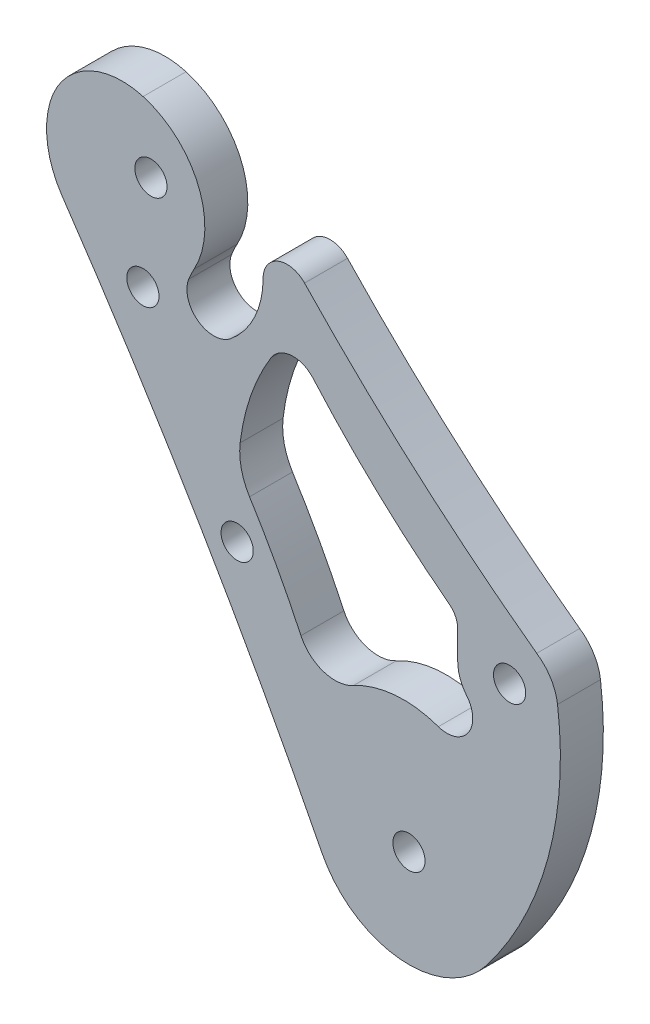
ISO-10303-21;
HEADER;
FILE_DESCRIPTION(('STEP AP214'),'2;1');
FILE_NAME('part.step','',(''),(''),'','','');
FILE_SCHEMA(('AUTOMOTIVE_DESIGN { 1 0 10303 214 1 1 1 1 }'));
ENDSEC;
DATA;
#1=APPLICATION_CONTEXT('core data for automotive mechanical design processes');
#2=APPLICATION_PROTOCOL_DEFINITION('international standard','automotive_design',2000,#1);
#3=PRODUCT_CONTEXT('',#1,'mechanical');
#4=PRODUCT('Part','Part','',(#3));
#5=PRODUCT_RELATED_PRODUCT_CATEGORY('part','',(#4));
#6=PRODUCT_DEFINITION_FORMATION('','',#4);
#7=PRODUCT_DEFINITION_CONTEXT('part definition',#1,'design');
#8=PRODUCT_DEFINITION('design','',#6,#7);
#9=PRODUCT_DEFINITION_SHAPE('','',#8);
#10=(LENGTH_UNIT() NAMED_UNIT(*) SI_UNIT(.MILLI.,.METRE.));
#11=(NAMED_UNIT(*) PLANE_ANGLE_UNIT() SI_UNIT($,.RADIAN.));
#12=(NAMED_UNIT(*) SI_UNIT($,.STERADIAN.) SOLID_ANGLE_UNIT());
#13=UNCERTAINTY_MEASURE_WITH_UNIT(LENGTH_MEASURE(1.E-05),#10,'distance_accuracy_value','');
#14=(GEOMETRIC_REPRESENTATION_CONTEXT(3) GLOBAL_UNCERTAINTY_ASSIGNED_CONTEXT((#13)) GLOBAL_UNIT_ASSIGNED_CONTEXT((#10,
#11,#12)) REPRESENTATION_CONTEXT('',''));
#15=CARTESIAN_POINT('',(0.,0.,0.));
#16=DIRECTION('',(0.,0.,1.));
#17=DIRECTION('',(1.,0.,0.));
#18=AXIS2_PLACEMENT_3D('',#15,#16,#17);
#19=CARTESIAN_POINT('',(66.2668362517356,54.831618734875,4.));
#20=DIRECTION('',(0.,0.,-1.));
#21=DIRECTION('',(-1.,0.,0.));
#22=AXIS2_PLACEMENT_3D('',#19,#20,#21);
#23=PLANE('',#22);
#24=CARTESIAN_POINT('',(76.3123714532048,30.2000942948942,4.));
#25=DIRECTION('',(0.,0.,1.));
#26=DIRECTION('',(1.,0.,0.));
#27=AXIS2_PLACEMENT_3D('',#24,#25,#26);
#28=CIRCLE('',#27,1.5);
#29=CARTESIAN_POINT('',(77.8123714532048,30.2000942948942,4.));
#30=VERTEX_POINT('',#29);
#31=EDGE_CURVE('E253',#30,#30,#28,.T.);
#32=ORIENTED_EDGE('',*,*,#31,.F.);
#33=EDGE_LOOP('',(#32));
#34=FACE_BOUND('',#33,.T.);
#35=CARTESIAN_POINT('',(67.5354671080567,46.360427952564,4.));
#36=DIRECTION('',(0.,0.,1.));
#37=DIRECTION('',(1.,0.,0.));
#38=AXIS2_PLACEMENT_3D('',#35,#36,#37);
#39=CIRCLE('',#38,1.50110642000384);
#40=CARTESIAN_POINT('',(69.0365735280606,46.360427952564,4.));
#41=VERTEX_POINT('',#40);
#42=EDGE_CURVE('E318',#41,#41,#39,.T.);
#43=ORIENTED_EDGE('',*,*,#42,.F.);
#44=EDGE_LOOP('',(#43));
#45=FACE_BOUND('',#44,.T.);
#46=CARTESIAN_POINT('',(92.3123714532048,13.2000942948942,4.));
#47=DIRECTION('',(0.,0.,1.));
#48=DIRECTION('',(1.,0.,0.));
#49=AXIS2_PLACEMENT_3D('',#46,#47,#48);
#50=CIRCLE('',#49,1.5);
#51=CARTESIAN_POINT('',(93.8123714532048,13.2000942948942,4.));
#52=VERTEX_POINT('',#51);
#53=EDGE_CURVE('E326',#52,#52,#50,.T.);
#54=ORIENTED_EDGE('',*,*,#53,.F.);
#55=EDGE_LOOP('',(#54));
#56=FACE_BOUND('',#55,.T.);
#57=CARTESIAN_POINT('',(101.682075095834,31.4335430539551,4.));
#58=DIRECTION('',(0.,0.,1.));
#59=DIRECTION('',(1.,0.,0.));
#60=AXIS2_PLACEMENT_3D('',#57,#58,#59);
#61=CIRCLE('',#60,1.5);
#62=CARTESIAN_POINT('',(103.182075095834,31.4335430539551,4.));
#63=VERTEX_POINT('',#62);
#64=EDGE_CURVE('E334',#63,#63,#61,.T.);
#65=ORIENTED_EDGE('',*,*,#64,.F.);
#66=EDGE_LOOP('',(#65));
#67=FACE_BOUND('',#66,.T.);
#68=CARTESIAN_POINT('',(68.2854671080567,55.560427952564,4.));
#69=DIRECTION('',(0.,0.,1.));
#70=DIRECTION('',(1.,0.,0.));
#71=AXIS2_PLACEMENT_3D('',#68,#69,#70);
#72=CIRCLE('',#71,1.5);
#73=CARTESIAN_POINT('',(69.7854671080567,55.560427952564,4.));
#74=VERTEX_POINT('',#73);
#75=EDGE_CURVE('E342',#74,#74,#72,.T.);
#76=ORIENTED_EDGE('',*,*,#75,.F.);
#77=EDGE_LOOP('',(#76));
#78=FACE_BOUND('',#77,.T.);
#79=CARTESIAN_POINT('',(66.9297595318174,54.6414005412217,4.));
#80=DIRECTION('',(0.,0.,1.));
#81=DIRECTION('',(-1.,0.,0.));
#82=AXIS2_PLACEMENT_3D('',#79,#80,#81);
#83=CIRCLE('',#82,8.36216252942286);
#84=CARTESIAN_POINT('',(58.8919443420733,56.9477589574276,4.));
#85=VERTEX_POINT('',#84);
#86=CARTESIAN_POINT('',(60.0269446482824,49.9215585044443,4.));
#87=VERTEX_POINT('',#86);
#88=EDGE_CURVE('E350',#85,#87,#83,.T.);
#89=ORIENTED_EDGE('',*,*,#88,.T.);
#90=CARTESIAN_POINT('',(-239.950657402607,-155.189967755456,4.));
#91=DIRECTION('',(0.,0.,-1.));
#92=DIRECTION('',(-1.,0.,0.));
#93=AXIS2_PLACEMENT_3D('',#90,#91,#92);
#94=CIRCLE('',#93,363.396890378643);
#95=CARTESIAN_POINT('',(84.1952739936411,9.086369847153,4.));
#96=VERTEX_POINT('',#95);
#97=EDGE_CURVE('E354',#87,#96,#94,.T.);
#98=ORIENTED_EDGE('',*,*,#97,.T.);
#99=CARTESIAN_POINT('',(92.3123714532048,13.2000942948942,4.));
#100=DIRECTION('',(0.,0.,1.));
#101=DIRECTION('',(1.,0.,0.));
#102=AXIS2_PLACEMENT_3D('',#99,#100,#101);
#103=CIRCLE('',#102,9.09999999999997);
#104=CARTESIAN_POINT('',(99.5090678289681,7.63075310629086,4.));
#105=VERTEX_POINT('',#104);
#106=EDGE_CURVE('E358',#96,#105,#103,.T.);
#107=ORIENTED_EDGE('',*,*,#106,.T.);
#108=CARTESIAN_POINT('',(73.4111578948811,27.8272651089185,4.));
#109=DIRECTION('',(0.,0.,1.));
#110=DIRECTION('',(1.,0.,0.));
#111=AXIS2_PLACEMENT_3D('',#108,#109,#110);
#112=CIRCLE('',#111,33.);
#113=CARTESIAN_POINT('',(106.145904127564,32.0029553610661,4.));
#114=VERTEX_POINT('',#113);
#115=EDGE_CURVE('E361',#105,#114,#112,.T.);
#116=ORIENTED_EDGE('',*,*,#115,.T.);
#117=CARTESIAN_POINT('',(101.682075095834,31.4335430539551,4.));
#118=DIRECTION('',(0.,0.,1.));
#119=DIRECTION('',(1.,0.,0.));
#120=AXIS2_PLACEMENT_3D('',#117,#118,#119);
#121=CIRCLE('',#120,4.49999999999999);
#122=CARTESIAN_POINT('',(104.210334732775,35.1561635299391,4.));
#123=VERTEX_POINT('',#122);
#124=EDGE_CURVE('E364',#114,#123,#121,.T.);
#125=ORIENTED_EDGE('',*,*,#124,.T.);
#126=CARTESIAN_POINT('',(199.067313338011,164.628673960799,4.));
#127=DIRECTION('',(0.,0.,-1.));
#128=DIRECTION('',(1.,0.,0.));
#129=AXIS2_PLACEMENT_3D('',#126,#127,#128);
#130=CIRCLE('',#129,160.502265863704);
#131=CARTESIAN_POINT('',(82.5900781471104,54.2020873538277,4.));
#132=VERTEX_POINT('',#131);
#133=EDGE_CURVE('E367',#123,#132,#130,.T.);
#134=ORIENTED_EDGE('',*,*,#133,.T.);
#135=CARTESIAN_POINT('',(80.9667985282905,52.6631323200736,4.));
#136=DIRECTION('',(0.,0.,1.));
#137=DIRECTION('',(-1.,0.,0.));
#138=AXIS2_PLACEMENT_3D('',#135,#136,#137);
#139=CIRCLE('',#138,2.23683242930559);
#140=CARTESIAN_POINT('',(78.7299663456567,52.6620818311912,4.));
#141=VERTEX_POINT('',#140);
#142=EDGE_CURVE('E370',#132,#141,#139,.T.);
#143=ORIENTED_EDGE('',*,*,#142,.T.);
#144=CARTESIAN_POINT('',(70.4773402182856,52.6582061305081,4.));
#145=DIRECTION('',(0.,0.,-1.));
#146=DIRECTION('',(1.,0.,0.));
#147=AXIS2_PLACEMENT_3D('',#144,#145,#146);
#148=CIRCLE('',#147,8.2526270374464);
#149=CARTESIAN_POINT('',(75.7248954576943,46.2888249181339,4.));
#150=VERTEX_POINT('',#149);
#151=EDGE_CURVE('E373',#141,#150,#148,.T.);
#152=ORIENTED_EDGE('',*,*,#151,.T.);
#153=CARTESIAN_POINT('',(74.1352333974826,48.2183260283457,4.));
#154=DIRECTION('',(0.,0.,-1.));
#155=DIRECTION('',(1.,0.,0.));
#156=AXIS2_PLACEMENT_3D('',#153,#154,#155);
#157=CIRCLE('',#156,2.49999999999753);
#158=CARTESIAN_POINT('',(71.8052805872567,49.1245930431422,4.));
#159=VERTEX_POINT('',#158);
#160=EDGE_CURVE('E376',#150,#159,#157,.T.);
#161=ORIENTED_EDGE('',*,*,#160,.T.);
#162=CARTESIAN_POINT('',(79.9260279481337,45.965917280973,4.));
#163=DIRECTION('',(0.,0.,-1.));
#164=DIRECTION('',(1.,0.,0.));
#165=AXIS2_PLACEMENT_3D('',#162,#163,#164);
#166=CIRCLE('',#165,8.7134247153314);
#167=CARTESIAN_POINT('',(72.3056832447279,50.1913304999403,4.));
#168=VERTEX_POINT('',#167);
#169=EDGE_CURVE('E379',#159,#168,#166,.T.);
#170=ORIENTED_EDGE('',*,*,#169,.T.);
#171=CARTESIAN_POINT('',(65.3247920132911,54.0621724680605,4.));
#172=DIRECTION('',(0.,0.,1.));
#173=DIRECTION('',(-1.,0.,0.));
#174=AXIS2_PLACEMENT_3D('',#171,#172,#173);
#175=CIRCLE('',#174,7.98224654638745);
#176=CARTESIAN_POINT('',(67.5540704786133,61.7268040607311,4.));
#177=VERTEX_POINT('',#176);
#178=EDGE_CURVE('E382',#168,#177,#175,.T.);
#179=ORIENTED_EDGE('',*,*,#178,.T.);
#180=CARTESIAN_POINT('',(65.6039129716538,55.0218369285283,4.));
#181=DIRECTION('',(0.,0.,1.));
#182=DIRECTION('',(-1.,0.,0.));
#183=AXIS2_PLACEMENT_3D('',#180,#181,#182);
#184=CIRCLE('',#183,6.9828145146404);
#185=EDGE_CURVE('E385',#177,#85,#184,.T.);
#186=ORIENTED_EDGE('',*,*,#185,.T.);
#187=EDGE_LOOP('',(#89,#98,#107,#116,#125,#134,#143,#152,#161,#170,#179,#186));
#188=FACE_BOUND('',#187,.T.);
#189=CARTESIAN_POINT('',(82.6003377734058,37.6113987415421,4.));
#190=DIRECTION('',(0.,0.,1.));
#191=DIRECTION('',(1.,0.,0.));
#192=AXIS2_PLACEMENT_3D('',#189,#190,#191);
#193=CIRCLE('',#192,6.04988415179236);
#194=CARTESIAN_POINT('',(76.5917089679829,38.3167200362377,4.));
#195=VERTEX_POINT('',#194);
#196=CARTESIAN_POINT('',(77.4671539045136,34.4095989947975,4.));
#197=VERTEX_POINT('',#196);
#198=EDGE_CURVE('E197',#195,#197,#193,.T.);
#199=ORIENTED_EDGE('',*,*,#198,.F.);
#200=CARTESIAN_POINT('',(96.9243505215598,35.9299783136989,4.));
#201=DIRECTION('',(0.,0.,1.));
#202=DIRECTION('',(1.,0.,0.));
#203=AXIS2_PLACEMENT_3D('',#200,#201,#202);
#204=CIRCLE('',#203,20.4722458122296);
#205=CARTESIAN_POINT('',(79.4458109725354,46.5889418575684,4.));
#206=VERTEX_POINT('',#205);
#207=EDGE_CURVE('E248',#206,#195,#204,.T.);
#208=ORIENTED_EDGE('',*,*,#207,.F.);
#209=CARTESIAN_POINT('',(81.5347627293735,45.315033327706,4.));
#210=DIRECTION('',(0.,0.,1.));
#211=DIRECTION('',(1.,0.,0.));
#212=AXIS2_PLACEMENT_3D('',#209,#210,#211);
#213=CIRCLE('',#212,2.44674526358041);
#214=CARTESIAN_POINT('',(83.3729221409373,46.9298808011637,4.));
#215=VERTEX_POINT('',#214);
#216=EDGE_CURVE('E245',#215,#206,#213,.T.);
#217=ORIENTED_EDGE('',*,*,#216,.F.);
#218=CARTESIAN_POINT('',(150.51265424025,105.913027783483,4.));
#219=DIRECTION('',(0.,0.,-1.));
#220=DIRECTION('',(-1.,0.,0.));
#221=AXIS2_PLACEMENT_3D('',#218,#219,#220);
#222=CIRCLE('',#221,89.3686480501152);
#223=CARTESIAN_POINT('',(96.0817946008957,35.0325877931282,4.));
#224=VERTEX_POINT('',#223);
#225=EDGE_CURVE('E242',#224,#215,#222,.T.);
#226=ORIENTED_EDGE('',*,*,#225,.F.);
#227=CARTESIAN_POINT('',(94.8854159392447,33.4746508710447,4.));
#228=DIRECTION('',(0.,0.,1.));
#229=DIRECTION('',(1.,0.,0.));
#230=AXIS2_PLACEMENT_3D('',#227,#228,#229);
#231=CIRCLE('',#230,1.9643037838493);
#232=CARTESIAN_POINT('',(96.849719723094,33.4746508710447,4.));
#233=VERTEX_POINT('',#232);
#234=EDGE_CURVE('E239',#233,#224,#231,.T.);
#235=ORIENTED_EDGE('',*,*,#234,.F.);
#236=DIRECTION('',(0.,1.,0.));
#237=VECTOR('',#236,1.);
#238=CARTESIAN_POINT('',(96.849719723094,30.8489992327096,4.));
#239=LINE('',#238,#237);
#240=CARTESIAN_POINT('',(96.849719723094,30.8489992327096,4.));
#241=VERTEX_POINT('',#240);
#242=EDGE_CURVE('E236',#241,#233,#239,.T.);
#243=ORIENTED_EDGE('',*,*,#242,.F.);
#244=CARTESIAN_POINT('',(100.644803888709,30.8489992327096,4.));
#245=DIRECTION('',(0.,0.,-1.));
#246=DIRECTION('',(-1.,0.,0.));
#247=AXIS2_PLACEMENT_3D('',#244,#245,#246);
#248=CIRCLE('',#247,3.79508416561466);
#249=CARTESIAN_POINT('',(97.7092386530645,28.4437714739773,4.));
#250=VERTEX_POINT('',#249);
#251=EDGE_CURVE('E233',#250,#241,#248,.T.);
#252=ORIENTED_EDGE('',*,*,#251,.F.);
#253=CARTESIAN_POINT('',(95.8535239103705,26.9233090576697,4.));
#254=DIRECTION('',(0.,0.,1.));
#255=DIRECTION('',(1.,0.,0.));
#256=AXIS2_PLACEMENT_3D('',#253,#254,#255);
#257=CIRCLE('',#256,2.39905880829459);
#258=CARTESIAN_POINT('',(95.0511730238912,24.6623985727938,4.));
#259=VERTEX_POINT('',#258);
#260=EDGE_CURVE('E230',#259,#250,#257,.T.);
#261=ORIENTED_EDGE('',*,*,#260,.F.);
#262=CARTESIAN_POINT('',(91.8101069202838,15.5295360567749,4.));
#263=DIRECTION('',(0.,0.,-1.));
#264=DIRECTION('',(-1.,0.,0.));
#265=AXIS2_PLACEMENT_3D('',#262,#263,#264);
#266=CIRCLE('',#265,9.69090745103137);
#267=CARTESIAN_POINT('',(87.1342363780843,24.0177585972745,4.));
#268=VERTEX_POINT('',#267);
#269=EDGE_CURVE('E224',#268,#259,#266,.T.);
#270=ORIENTED_EDGE('',*,*,#269,.F.);
#271=CARTESIAN_POINT('',(85.4377471522733,27.0974371205104,4.));
#272=DIRECTION('',(0.,0.,1.));
#273=DIRECTION('',(1.,0.,0.));
#274=AXIS2_PLACEMENT_3D('',#271,#272,#273);
#275=CIRCLE('',#274,3.51603405839208);
#276=CARTESIAN_POINT('',(82.254048976086,25.6052704332014,4.));
#277=VERTEX_POINT('',#276);
#278=EDGE_CURVE('E220',#277,#268,#275,.T.);
#279=ORIENTED_EDGE('',*,*,#278,.F.);
#280=CARTESIAN_POINT('',(6.21597439059316,-10.0329953773693,4.));
#281=DIRECTION('',(0.,0.,-1.));
#282=DIRECTION('',(-1.,0.,0.));
#283=AXIS2_PLACEMENT_3D('',#280,#281,#282);
#284=CIRCLE('',#283,83.9754415091333);
#285=EDGE_CURVE('E206',#197,#277,#284,.T.);
#286=ORIENTED_EDGE('',*,*,#285,.F.);
#287=EDGE_LOOP('',(#199,#208,#217,#226,#235,#243,#252,#261,#270,#279,#286));
#288=FACE_BOUND('',#287,.T.);
#289=ADVANCED_FACE('F41',(#34,#45,#56,#67,#78,#188,#288),#23,.F.);
#290=CARTESIAN_POINT('',(66.2668362517356,54.831618734875,0.));
#291=DIRECTION('',(0.,0.,-1.));
#292=DIRECTION('',(-1.,0.,0.));
#293=AXIS2_PLACEMENT_3D('',#290,#291,#292);
#294=PLANE('',#293);
#295=CARTESIAN_POINT('',(76.3123714532048,30.2000942948942,0.));
#296=DIRECTION('',(0.,0.,-1.));
#297=DIRECTION('',(-1.,0.,0.));
#298=AXIS2_PLACEMENT_3D('',#295,#296,#297);
#299=CIRCLE('',#298,1.5);
#300=CARTESIAN_POINT('',(74.8123714532047,30.2000942948942,0.));
#301=VERTEX_POINT('',#300);
#302=EDGE_CURVE('E797',#301,#301,#299,.F.);
#303=ORIENTED_EDGE('',*,*,#302,.T.);
#304=EDGE_LOOP('',(#303));
#305=FACE_BOUND('',#304,.T.);
#306=CARTESIAN_POINT('',(92.3123714532048,13.2000942948942,0.));
#307=DIRECTION('',(0.,0.,1.));
#308=DIRECTION('',(1.,0.,0.));
#309=AXIS2_PLACEMENT_3D('',#306,#307,#308);
#310=CIRCLE('',#309,1.5);
#311=CARTESIAN_POINT('',(93.8123714532048,13.2000942948942,0.));
#312=VERTEX_POINT('',#311);
#313=EDGE_CURVE('E322',#312,#312,#310,.T.);
#314=ORIENTED_EDGE('',*,*,#313,.T.);
#315=EDGE_LOOP('',(#314));
#316=FACE_BOUND('',#315,.T.);
#317=CARTESIAN_POINT('',(68.2854671080567,55.560427952564,0.));
#318=DIRECTION('',(0.,0.,1.));
#319=DIRECTION('',(1.,0.,0.));
#320=AXIS2_PLACEMENT_3D('',#317,#318,#319);
#321=CIRCLE('',#320,1.5);
#322=CARTESIAN_POINT('',(69.7854671080567,55.560427952564,0.));
#323=VERTEX_POINT('',#322);
#324=EDGE_CURVE('E338',#323,#323,#321,.T.);
#325=ORIENTED_EDGE('',*,*,#324,.T.);
#326=EDGE_LOOP('',(#325));
#327=FACE_BOUND('',#326,.T.);
#328=CARTESIAN_POINT('',(66.9297595318174,54.6414005412217,0.));
#329=DIRECTION('',(0.,0.,1.));
#330=DIRECTION('',(-1.,0.,0.));
#331=AXIS2_PLACEMENT_3D('',#328,#329,#330);
#332=CIRCLE('',#331,8.36216252942286);
#333=CARTESIAN_POINT('',(58.8919443420733,56.9477589574276,0.));
#334=VERTEX_POINT('',#333);
#335=CARTESIAN_POINT('',(60.0269446482824,49.9215585044443,0.));
#336=VERTEX_POINT('',#335);
#337=EDGE_CURVE('E346',#334,#336,#332,.T.);
#338=ORIENTED_EDGE('',*,*,#337,.F.);
#339=CARTESIAN_POINT('',(65.6039129716538,55.0218369285283,0.));
#340=DIRECTION('',(0.,0.,1.));
#341=DIRECTION('',(-1.,0.,0.));
#342=AXIS2_PLACEMENT_3D('',#339,#340,#341);
#343=CIRCLE('',#342,6.9828145146404);
#344=CARTESIAN_POINT('',(67.5540704786133,61.7268040607311,0.));
#345=VERTEX_POINT('',#344);
#346=EDGE_CURVE('E355',#345,#334,#343,.T.);
#347=ORIENTED_EDGE('',*,*,#346,.F.);
#348=CARTESIAN_POINT('',(65.3247920132911,54.0621724680605,0.));
#349=DIRECTION('',(0.,0.,1.));
#350=DIRECTION('',(-1.,0.,0.));
#351=AXIS2_PLACEMENT_3D('',#348,#349,#350);
#352=CIRCLE('',#351,7.98224654638745);
#353=CARTESIAN_POINT('',(72.3056832447279,50.1913304999403,0.));
#354=VERTEX_POINT('',#353);
#355=EDGE_CURVE('E419',#354,#345,#352,.T.);
#356=ORIENTED_EDGE('',*,*,#355,.F.);
#357=CARTESIAN_POINT('',(79.9260279481337,45.965917280973,0.));
#358=DIRECTION('',(0.,0.,-1.));
#359=DIRECTION('',(1.,0.,0.));
#360=AXIS2_PLACEMENT_3D('',#357,#358,#359);
#361=CIRCLE('',#360,8.7134247153314);
#362=CARTESIAN_POINT('',(71.8052805872567,49.1245930431422,0.));
#363=VERTEX_POINT('',#362);
#364=EDGE_CURVE('E416',#363,#354,#361,.T.);
#365=ORIENTED_EDGE('',*,*,#364,.F.);
#366=CARTESIAN_POINT('',(74.1352333974826,48.2183260283457,0.));
#367=DIRECTION('',(0.,0.,-1.));
#368=DIRECTION('',(1.,0.,0.));
#369=AXIS2_PLACEMENT_3D('',#366,#367,#368);
#370=CIRCLE('',#369,2.49999999999753);
#371=CARTESIAN_POINT('',(75.7248954576943,46.2888249181339,0.));
#372=VERTEX_POINT('',#371);
#373=EDGE_CURVE('E413',#372,#363,#370,.T.);
#374=ORIENTED_EDGE('',*,*,#373,.F.);
#375=CARTESIAN_POINT('',(70.4773402182856,52.6582061305081,0.));
#376=DIRECTION('',(0.,0.,-1.));
#377=DIRECTION('',(1.,0.,0.));
#378=AXIS2_PLACEMENT_3D('',#375,#376,#377);
#379=CIRCLE('',#378,8.2526270374464);
#380=CARTESIAN_POINT('',(78.7299663456567,52.6620818311912,0.));
#381=VERTEX_POINT('',#380);
#382=EDGE_CURVE('E410',#381,#372,#379,.T.);
#383=ORIENTED_EDGE('',*,*,#382,.F.);
#384=CARTESIAN_POINT('',(80.9667985282905,52.6631323200736,0.));
#385=DIRECTION('',(0.,0.,1.));
#386=DIRECTION('',(-1.,0.,0.));
#387=AXIS2_PLACEMENT_3D('',#384,#385,#386);
#388=CIRCLE('',#387,2.23683242930559);
#389=CARTESIAN_POINT('',(82.5900781471104,54.2020873538277,0.));
#390=VERTEX_POINT('',#389);
#391=EDGE_CURVE('E407',#390,#381,#388,.T.);
#392=ORIENTED_EDGE('',*,*,#391,.F.);
#393=CARTESIAN_POINT('',(199.067313338011,164.628673960799,0.));
#394=DIRECTION('',(0.,0.,-1.));
#395=DIRECTION('',(1.,0.,0.));
#396=AXIS2_PLACEMENT_3D('',#393,#394,#395);
#397=CIRCLE('',#396,160.502265863704);
#398=CARTESIAN_POINT('',(104.210334732775,35.1561635299391,0.));
#399=VERTEX_POINT('',#398);
#400=EDGE_CURVE('E404',#399,#390,#397,.T.);
#401=ORIENTED_EDGE('',*,*,#400,.F.);
#402=CARTESIAN_POINT('',(101.682075095834,31.4335430539551,0.));
#403=DIRECTION('',(0.,0.,1.));
#404=DIRECTION('',(1.,0.,0.));
#405=AXIS2_PLACEMENT_3D('',#402,#403,#404);
#406=CIRCLE('',#405,4.49999999999999);
#407=CARTESIAN_POINT('',(106.145904127564,32.0029553610661,0.));
#408=VERTEX_POINT('',#407);
#409=EDGE_CURVE('E401',#408,#399,#406,.T.);
#410=ORIENTED_EDGE('',*,*,#409,.F.);
#411=CARTESIAN_POINT('',(73.4111578948811,27.8272651089185,0.));
#412=DIRECTION('',(0.,0.,1.));
#413=DIRECTION('',(1.,0.,0.));
#414=AXIS2_PLACEMENT_3D('',#411,#412,#413);
#415=CIRCLE('',#414,33.);
#416=CARTESIAN_POINT('',(99.5090678289681,7.63075310629086,0.));
#417=VERTEX_POINT('',#416);
#418=EDGE_CURVE('E398',#417,#408,#415,.T.);
#419=ORIENTED_EDGE('',*,*,#418,.F.);
#420=CARTESIAN_POINT('',(92.3123714532048,13.2000942948942,0.));
#421=DIRECTION('',(0.,0.,1.));
#422=DIRECTION('',(1.,0.,0.));
#423=AXIS2_PLACEMENT_3D('',#420,#421,#422);
#424=CIRCLE('',#423,9.09999999999997);
#425=CARTESIAN_POINT('',(84.1952739936411,9.086369847153,0.));
#426=VERTEX_POINT('',#425);
#427=EDGE_CURVE('E395',#426,#417,#424,.T.);
#428=ORIENTED_EDGE('',*,*,#427,.F.);
#429=CARTESIAN_POINT('',(-239.950657402607,-155.189967755456,0.));
#430=DIRECTION('',(0.,0.,-1.));
#431=DIRECTION('',(-1.,0.,0.));
#432=AXIS2_PLACEMENT_3D('',#429,#430,#431);
#433=CIRCLE('',#432,363.396890378643);
#434=EDGE_CURVE('E392',#336,#426,#433,.T.);
#435=ORIENTED_EDGE('',*,*,#434,.F.);
#436=EDGE_LOOP('',(#338,#347,#356,#365,#374,#383,#392,#401,#410,#419,#428,#435));
#437=FACE_BOUND('',#436,.T.);
#438=CARTESIAN_POINT('',(101.682075095834,31.4335430539551,0.));
#439=DIRECTION('',(0.,0.,1.));
#440=DIRECTION('',(1.,0.,0.));
#441=AXIS2_PLACEMENT_3D('',#438,#439,#440);
#442=CIRCLE('',#441,1.5);
#443=CARTESIAN_POINT('',(103.182075095834,31.4335430539551,0.));
#444=VERTEX_POINT('',#443);
#445=EDGE_CURVE('E330',#444,#444,#442,.T.);
#446=ORIENTED_EDGE('',*,*,#445,.T.);
#447=EDGE_LOOP('',(#446));
#448=FACE_BOUND('',#447,.T.);
#449=CARTESIAN_POINT('',(67.5354671080567,46.360427952564,0.));
#450=DIRECTION('',(0.,0.,1.));
#451=DIRECTION('',(1.,0.,0.));
#452=AXIS2_PLACEMENT_3D('',#449,#450,#451);
#453=CIRCLE('',#452,1.50110642000384);
#454=CARTESIAN_POINT('',(69.0365735280606,46.360427952564,0.));
#455=VERTEX_POINT('',#454);
#456=EDGE_CURVE('E215',#455,#455,#453,.T.);
#457=ORIENTED_EDGE('',*,*,#456,.T.);
#458=EDGE_LOOP('',(#457));
#459=FACE_BOUND('',#458,.T.);
#460=CARTESIAN_POINT('',(96.9243505215598,35.9299783136989,0.));
#461=DIRECTION('',(0.,0.,1.));
#462=DIRECTION('',(1.,0.,0.));
#463=AXIS2_PLACEMENT_3D('',#460,#461,#462);
#464=CIRCLE('',#463,20.4722458122296);
#465=CARTESIAN_POINT('',(79.4458109725354,46.5889418575684,0.));
#466=VERTEX_POINT('',#465);
#467=CARTESIAN_POINT('',(76.5917089679829,38.3167200362377,0.));
#468=VERTEX_POINT('',#467);
#469=EDGE_CURVE('E207',#466,#468,#464,.T.);
#470=ORIENTED_EDGE('',*,*,#469,.T.);
#471=CARTESIAN_POINT('',(82.6003377734058,37.6113987415421,0.));
#472=DIRECTION('',(0.,0.,1.));
#473=DIRECTION('',(1.,0.,0.));
#474=AXIS2_PLACEMENT_3D('',#471,#472,#473);
#475=CIRCLE('',#474,6.04988415179236);
#476=CARTESIAN_POINT('',(77.4671539045136,34.4095989947975,0.));
#477=VERTEX_POINT('',#476);
#478=EDGE_CURVE('E65',#468,#477,#475,.T.);
#479=ORIENTED_EDGE('',*,*,#478,.T.);
#480=CARTESIAN_POINT('',(6.21597439059316,-10.0329953773693,0.));
#481=DIRECTION('',(0.,0.,-1.));
#482=DIRECTION('',(-1.,0.,0.));
#483=AXIS2_PLACEMENT_3D('',#480,#481,#482);
#484=CIRCLE('',#483,83.9754415091333);
#485=CARTESIAN_POINT('',(82.254048976086,25.6052704332014,0.));
#486=VERTEX_POINT('',#485);
#487=EDGE_CURVE('E213',#477,#486,#484,.T.);
#488=ORIENTED_EDGE('',*,*,#487,.T.);
#489=CARTESIAN_POINT('',(85.4377471522733,27.0974371205104,0.));
#490=DIRECTION('',(0.,0.,1.));
#491=DIRECTION('',(1.,0.,0.));
#492=AXIS2_PLACEMENT_3D('',#489,#490,#491);
#493=CIRCLE('',#492,3.51603405839208);
#494=CARTESIAN_POINT('',(87.1342363780843,24.0177585972745,0.));
#495=VERTEX_POINT('',#494);
#496=EDGE_CURVE('E256',#486,#495,#493,.T.);
#497=ORIENTED_EDGE('',*,*,#496,.T.);
#498=CARTESIAN_POINT('',(91.8101069202838,15.5295360567749,0.));
#499=DIRECTION('',(0.,0.,-1.));
#500=DIRECTION('',(-1.,0.,0.));
#501=AXIS2_PLACEMENT_3D('',#498,#499,#500);
#502=CIRCLE('',#501,9.69090745103137);
#503=CARTESIAN_POINT('',(95.0511730238912,24.6623985727938,0.));
#504=VERTEX_POINT('',#503);
#505=EDGE_CURVE('E260',#495,#504,#502,.T.);
#506=ORIENTED_EDGE('',*,*,#505,.T.);
#507=CARTESIAN_POINT('',(95.8535239103705,26.9233090576697,0.));
#508=DIRECTION('',(0.,0.,1.));
#509=DIRECTION('',(1.,0.,0.));
#510=AXIS2_PLACEMENT_3D('',#507,#508,#509);
#511=CIRCLE('',#510,2.39905880829459);
#512=CARTESIAN_POINT('',(97.7092386530645,28.4437714739773,0.));
#513=VERTEX_POINT('',#512);
#514=EDGE_CURVE('E264',#504,#513,#511,.T.);
#515=ORIENTED_EDGE('',*,*,#514,.T.);
#516=CARTESIAN_POINT('',(100.644803888709,30.8489992327096,0.));
#517=DIRECTION('',(0.,0.,-1.));
#518=DIRECTION('',(-1.,0.,0.));
#519=AXIS2_PLACEMENT_3D('',#516,#517,#518);
#520=CIRCLE('',#519,3.79508416561466);
#521=CARTESIAN_POINT('',(96.849719723094,30.8489992327096,0.));
#522=VERTEX_POINT('',#521);
#523=EDGE_CURVE('E268',#513,#522,#520,.T.);
#524=ORIENTED_EDGE('',*,*,#523,.T.);
#525=DIRECTION('',(0.,1.,0.));
#526=VECTOR('',#525,1.);
#527=CARTESIAN_POINT('',(96.849719723094,30.8489992327096,0.));
#528=LINE('',#527,#526);
#529=CARTESIAN_POINT('',(96.849719723094,33.4746508710447,0.));
#530=VERTEX_POINT('',#529);
#531=EDGE_CURVE('E272',#522,#530,#528,.T.);
#532=ORIENTED_EDGE('',*,*,#531,.T.);
#533=CARTESIAN_POINT('',(94.8854159392447,33.4746508710447,0.));
#534=DIRECTION('',(0.,0.,1.));
#535=DIRECTION('',(1.,0.,0.));
#536=AXIS2_PLACEMENT_3D('',#533,#534,#535);
#537=CIRCLE('',#536,1.9643037838493);
#538=CARTESIAN_POINT('',(96.0817946008957,35.0325877931282,0.));
#539=VERTEX_POINT('',#538);
#540=EDGE_CURVE('E276',#530,#539,#537,.T.);
#541=ORIENTED_EDGE('',*,*,#540,.T.);
#542=CARTESIAN_POINT('',(150.51265424025,105.913027783483,0.));
#543=DIRECTION('',(0.,0.,-1.));
#544=DIRECTION('',(-1.,0.,0.));
#545=AXIS2_PLACEMENT_3D('',#542,#543,#544);
#546=CIRCLE('',#545,89.3686480501152);
#547=CARTESIAN_POINT('',(83.3729221409373,46.9298808011637,0.));
#548=VERTEX_POINT('',#547);
#549=EDGE_CURVE('E280',#539,#548,#546,.T.);
#550=ORIENTED_EDGE('',*,*,#549,.T.);
#551=CARTESIAN_POINT('',(81.5347627293735,45.315033327706,0.));
#552=DIRECTION('',(0.,0.,1.));
#553=DIRECTION('',(1.,0.,0.));
#554=AXIS2_PLACEMENT_3D('',#551,#552,#553);
#555=CIRCLE('',#554,2.44674526358041);
#556=EDGE_CURVE('E284',#548,#466,#555,.T.);
#557=ORIENTED_EDGE('',*,*,#556,.T.);
#558=EDGE_LOOP('',(#470,#479,#488,#497,#506,#515,#524,#532,#541,#550,#557));
#559=FACE_BOUND('',#558,.T.);
#560=ADVANCED_FACE('F474',(#305,#316,#327,#437,#448,#459,#559),#294,.T.);
#561=CARTESIAN_POINT('',(66.9297595318174,54.6414005412217,4.));
#562=DIRECTION('',(0.,0.,-1.));
#563=DIRECTION('',(-1.,0.,0.));
#564=AXIS2_PLACEMENT_3D('',#561,#562,#563);
#565=CYLINDRICAL_SURFACE('',#564,8.36216252942286);
#566=ORIENTED_EDGE('',*,*,#337,.T.);
#567=DIRECTION('',(0.,0.,-1.));
#568=VECTOR('',#567,1.);
#569=CARTESIAN_POINT('',(60.0269446482824,49.9215585044443,4.));
#570=LINE('',#569,#568);
#571=EDGE_CURVE('E11',#87,#336,#570,.T.);
#572=ORIENTED_EDGE('',*,*,#571,.F.);
#573=ORIENTED_EDGE('',*,*,#88,.F.);
#574=DIRECTION('',(0.,0.,-1.));
#575=VECTOR('',#574,1.);
#576=CARTESIAN_POINT('',(58.8919443420733,56.9477589574276,4.));
#577=LINE('',#576,#575);
#578=EDGE_CURVE('E388',#85,#334,#577,.T.);
#579=ORIENTED_EDGE('',*,*,#578,.T.);
#580=EDGE_LOOP('',(#566,#572,#573,#579));
#581=FACE_BOUND('',#580,.T.);
#582=ADVANCED_FACE('F43',(#581),#565,.T.);
#583=CARTESIAN_POINT('',(-239.950657402607,-155.189967755456,4.));
#584=DIRECTION('',(0.,0.,-1.));
#585=DIRECTION('',(-1.,0.,0.));
#586=AXIS2_PLACEMENT_3D('',#583,#584,#585);
#587=CYLINDRICAL_SURFACE('',#586,363.396890378643);
#588=ORIENTED_EDGE('',*,*,#434,.T.);
#589=DIRECTION('',(0.,0.,-1.));
#590=VECTOR('',#589,1.);
#591=CARTESIAN_POINT('',(84.1952739936411,9.086369847153,4.));
#592=LINE('',#591,#590);
#593=EDGE_CURVE('E50',#96,#426,#592,.T.);
#594=ORIENTED_EDGE('',*,*,#593,.F.);
#595=ORIENTED_EDGE('',*,*,#97,.F.);
#596=ORIENTED_EDGE('',*,*,#571,.T.);
#597=EDGE_LOOP('',(#588,#594,#595,#596));
#598=FACE_BOUND('',#597,.T.);
#599=ADVANCED_FACE('F491',(#598),#587,.F.);
#600=CARTESIAN_POINT('',(92.3123714532048,13.2000942948942,4.));
#601=DIRECTION('',(0.,0.,-1.));
#602=DIRECTION('',(-1.,0.,0.));
#603=AXIS2_PLACEMENT_3D('',#600,#601,#602);
#604=CYLINDRICAL_SURFACE('',#603,9.09999999999997);
#605=ORIENTED_EDGE('',*,*,#427,.T.);
#606=DIRECTION('',(0.,0.,-1.));
#607=VECTOR('',#606,1.);
#608=CARTESIAN_POINT('',(99.5090678289681,7.63075310629086,4.));
#609=LINE('',#608,#607);
#610=EDGE_CURVE('E459',#105,#417,#609,.T.);
#611=ORIENTED_EDGE('',*,*,#610,.F.);
#612=ORIENTED_EDGE('',*,*,#106,.F.);
#613=ORIENTED_EDGE('',*,*,#593,.T.);
#614=EDGE_LOOP('',(#605,#611,#612,#613));
#615=FACE_BOUND('',#614,.T.);
#616=ADVANCED_FACE('F468',(#615),#604,.T.);
#617=CARTESIAN_POINT('',(73.4111578948811,27.8272651089185,4.));
#618=DIRECTION('',(0.,0.,-1.));
#619=DIRECTION('',(-1.,0.,0.));
#620=AXIS2_PLACEMENT_3D('',#617,#618,#619);
#621=CYLINDRICAL_SURFACE('',#620,33.);
#622=ORIENTED_EDGE('',*,*,#418,.T.);
#623=DIRECTION('',(0.,0.,-1.));
#624=VECTOR('',#623,1.);
#625=CARTESIAN_POINT('',(106.145904127564,32.0029553610661,4.));
#626=LINE('',#625,#624);
#627=EDGE_CURVE('E455',#114,#408,#626,.T.);
#628=ORIENTED_EDGE('',*,*,#627,.F.);
#629=ORIENTED_EDGE('',*,*,#115,.F.);
#630=ORIENTED_EDGE('',*,*,#610,.T.);
#631=EDGE_LOOP('',(#622,#628,#629,#630));
#632=FACE_BOUND('',#631,.T.);
#633=ADVANCED_FACE('F480',(#632),#621,.T.);
#634=CARTESIAN_POINT('',(101.682075095834,31.4335430539551,4.));
#635=DIRECTION('',(0.,0.,-1.));
#636=DIRECTION('',(-1.,0.,0.));
#637=AXIS2_PLACEMENT_3D('',#634,#635,#636);
#638=CYLINDRICAL_SURFACE('',#637,4.49999999999999);
#639=ORIENTED_EDGE('',*,*,#409,.T.);
#640=DIRECTION('',(0.,0.,-1.));
#641=VECTOR('',#640,1.);
#642=CARTESIAN_POINT('',(104.210334732775,35.1561635299391,4.));
#643=LINE('',#642,#641);
#644=EDGE_CURVE('E451',#123,#399,#643,.T.);
#645=ORIENTED_EDGE('',*,*,#644,.F.);
#646=ORIENTED_EDGE('',*,*,#124,.F.);
#647=ORIENTED_EDGE('',*,*,#627,.T.);
#648=EDGE_LOOP('',(#639,#645,#646,#647));
#649=FACE_BOUND('',#648,.T.);
#650=ADVANCED_FACE('F484',(#649),#638,.T.);
#651=CARTESIAN_POINT('',(199.067313338011,164.628673960799,4.));
#652=DIRECTION('',(0.,0.,-1.));
#653=DIRECTION('',(-1.,0.,0.));
#654=AXIS2_PLACEMENT_3D('',#651,#652,#653);
#655=CYLINDRICAL_SURFACE('',#654,160.502265863704);
#656=ORIENTED_EDGE('',*,*,#400,.T.);
#657=DIRECTION('',(0.,0.,-1.));
#658=VECTOR('',#657,1.);
#659=CARTESIAN_POINT('',(82.5900781471104,54.2020873538277,4.));
#660=LINE('',#659,#658);
#661=EDGE_CURVE('E447',#132,#390,#660,.T.);
#662=ORIENTED_EDGE('',*,*,#661,.F.);
#663=ORIENTED_EDGE('',*,*,#133,.F.);
#664=ORIENTED_EDGE('',*,*,#644,.T.);
#665=EDGE_LOOP('',(#656,#662,#663,#664));
#666=FACE_BOUND('',#665,.T.);
#667=ADVANCED_FACE('F524',(#666),#655,.F.);
#668=CARTESIAN_POINT('',(80.9667985282905,52.6631323200736,4.));
#669=DIRECTION('',(0.,0.,-1.));
#670=DIRECTION('',(-1.,0.,0.));
#671=AXIS2_PLACEMENT_3D('',#668,#669,#670);
#672=CYLINDRICAL_SURFACE('',#671,2.23683242930559);
#673=ORIENTED_EDGE('',*,*,#391,.T.);
#674=DIRECTION('',(0.,0.,-1.));
#675=VECTOR('',#674,1.);
#676=CARTESIAN_POINT('',(78.7299663456567,52.6620818311912,4.));
#677=LINE('',#676,#675);
#678=EDGE_CURVE('E443',#141,#381,#677,.T.);
#679=ORIENTED_EDGE('',*,*,#678,.F.);
#680=ORIENTED_EDGE('',*,*,#142,.F.);
#681=ORIENTED_EDGE('',*,*,#661,.T.);
#682=EDGE_LOOP('',(#673,#679,#680,#681));
#683=FACE_BOUND('',#682,.T.);
#684=ADVANCED_FACE('F522',(#683),#672,.T.);
#685=CARTESIAN_POINT('',(70.4773402182856,52.6582061305081,4.));
#686=DIRECTION('',(0.,0.,-1.));
#687=DIRECTION('',(-1.,0.,0.));
#688=AXIS2_PLACEMENT_3D('',#685,#686,#687);
#689=CYLINDRICAL_SURFACE('',#688,8.2526270374464);
#690=ORIENTED_EDGE('',*,*,#382,.T.);
#691=DIRECTION('',(0.,0.,-1.));
#692=VECTOR('',#691,1.);
#693=CARTESIAN_POINT('',(75.7248954576943,46.2888249181339,4.));
#694=LINE('',#693,#692);
#695=EDGE_CURVE('E439',#150,#372,#694,.T.);
#696=ORIENTED_EDGE('',*,*,#695,.F.);
#697=ORIENTED_EDGE('',*,*,#151,.F.);
#698=ORIENTED_EDGE('',*,*,#678,.T.);
#699=EDGE_LOOP('',(#690,#696,#697,#698));
#700=FACE_BOUND('',#699,.T.);
#701=ADVANCED_FACE('F518',(#700),#689,.F.);
#702=CARTESIAN_POINT('',(74.1352333974826,48.2183260283457,4.));
#703=DIRECTION('',(0.,0.,-1.));
#704=DIRECTION('',(-1.,0.,0.));
#705=AXIS2_PLACEMENT_3D('',#702,#703,#704);
#706=CYLINDRICAL_SURFACE('',#705,2.49999999999753);
#707=ORIENTED_EDGE('',*,*,#373,.T.);
#708=DIRECTION('',(0.,0.,-1.));
#709=VECTOR('',#708,1.);
#710=CARTESIAN_POINT('',(71.8052805872567,49.1245930431422,4.));
#711=LINE('',#710,#709);
#712=EDGE_CURVE('E435',#159,#363,#711,.T.);
#713=ORIENTED_EDGE('',*,*,#712,.F.);
#714=ORIENTED_EDGE('',*,*,#160,.F.);
#715=ORIENTED_EDGE('',*,*,#695,.T.);
#716=EDGE_LOOP('',(#707,#713,#714,#715));
#717=FACE_BOUND('',#716,.T.);
#718=ADVANCED_FACE('F513',(#717),#706,.F.);
#719=CARTESIAN_POINT('',(79.9260279481337,45.965917280973,4.));
#720=DIRECTION('',(0.,0.,-1.));
#721=DIRECTION('',(-1.,0.,0.));
#722=AXIS2_PLACEMENT_3D('',#719,#720,#721);
#723=CYLINDRICAL_SURFACE('',#722,8.7134247153314);
#724=ORIENTED_EDGE('',*,*,#364,.T.);
#725=DIRECTION('',(0.,0.,-1.));
#726=VECTOR('',#725,1.);
#727=CARTESIAN_POINT('',(72.3056832447279,50.1913304999403,4.));
#728=LINE('',#727,#726);
#729=EDGE_CURVE('E431',#168,#354,#728,.T.);
#730=ORIENTED_EDGE('',*,*,#729,.F.);
#731=ORIENTED_EDGE('',*,*,#169,.F.);
#732=ORIENTED_EDGE('',*,*,#712,.T.);
#733=EDGE_LOOP('',(#724,#730,#731,#732));
#734=FACE_BOUND('',#733,.T.);
#735=ADVANCED_FACE('F507',(#734),#723,.F.);
#736=CARTESIAN_POINT('',(65.3247920132911,54.0621724680605,4.));
#737=DIRECTION('',(0.,0.,-1.));
#738=DIRECTION('',(-1.,0.,0.));
#739=AXIS2_PLACEMENT_3D('',#736,#737,#738);
#740=CYLINDRICAL_SURFACE('',#739,7.98224654638745);
#741=ORIENTED_EDGE('',*,*,#355,.T.);
#742=DIRECTION('',(0.,0.,-1.));
#743=VECTOR('',#742,1.);
#744=CARTESIAN_POINT('',(67.5540704786133,61.7268040607311,4.));
#745=LINE('',#744,#743);
#746=EDGE_CURVE('E427',#177,#345,#745,.T.);
#747=ORIENTED_EDGE('',*,*,#746,.F.);
#748=ORIENTED_EDGE('',*,*,#178,.F.);
#749=ORIENTED_EDGE('',*,*,#729,.T.);
#750=EDGE_LOOP('',(#741,#747,#748,#749));
#751=FACE_BOUND('',#750,.T.);
#752=ADVANCED_FACE('F503',(#751),#740,.T.);
#753=CARTESIAN_POINT('',(65.6039129716538,55.0218369285283,4.));
#754=DIRECTION('',(0.,0.,-1.));
#755=DIRECTION('',(-1.,0.,0.));
#756=AXIS2_PLACEMENT_3D('',#753,#754,#755);
#757=CYLINDRICAL_SURFACE('',#756,6.9828145146404);
#758=ORIENTED_EDGE('',*,*,#346,.T.);
#759=ORIENTED_EDGE('',*,*,#578,.F.);
#760=ORIENTED_EDGE('',*,*,#185,.F.);
#761=ORIENTED_EDGE('',*,*,#746,.T.);
#762=EDGE_LOOP('',(#758,#759,#760,#761));
#763=FACE_BOUND('',#762,.T.);
#764=ADVANCED_FACE('F498',(#763),#757,.T.);
#765=CARTESIAN_POINT('',(68.2854671080567,55.560427952564,4.));
#766=DIRECTION('',(0.,0.,-1.));
#767=DIRECTION('',(-1.,0.,0.));
#768=AXIS2_PLACEMENT_3D('',#765,#766,#767);
#769=CYLINDRICAL_SURFACE('',#768,1.5);
#770=ORIENTED_EDGE('',*,*,#75,.T.);
#771=EDGE_LOOP('',(#770));
#772=FACE_BOUND('',#771,.T.);
#773=ORIENTED_EDGE('',*,*,#324,.F.);
#774=EDGE_LOOP('',(#773));
#775=FACE_BOUND('',#774,.T.);
#776=ADVANCED_FACE('F544',(#772,#775),#769,.F.);
#777=CARTESIAN_POINT('',(101.682075095834,31.4335430539551,4.));
#778=DIRECTION('',(0.,0.,-1.));
#779=DIRECTION('',(-1.,0.,0.));
#780=AXIS2_PLACEMENT_3D('',#777,#778,#779);
#781=CYLINDRICAL_SURFACE('',#780,1.5);
#782=ORIENTED_EDGE('',*,*,#64,.T.);
#783=EDGE_LOOP('',(#782));
#784=FACE_BOUND('',#783,.T.);
#785=ORIENTED_EDGE('',*,*,#445,.F.);
#786=EDGE_LOOP('',(#785));
#787=FACE_BOUND('',#786,.T.);
#788=ADVANCED_FACE('F582',(#784,#787),#781,.F.);
#789=CARTESIAN_POINT('',(92.3123714532048,13.2000942948942,4.));
#790=DIRECTION('',(0.,0.,-1.));
#791=DIRECTION('',(-1.,0.,0.));
#792=AXIS2_PLACEMENT_3D('',#789,#790,#791);
#793=CYLINDRICAL_SURFACE('',#792,1.5);
#794=ORIENTED_EDGE('',*,*,#53,.T.);
#795=EDGE_LOOP('',(#794));
#796=FACE_BOUND('',#795,.T.);
#797=ORIENTED_EDGE('',*,*,#313,.F.);
#798=EDGE_LOOP('',(#797));
#799=FACE_BOUND('',#798,.T.);
#800=ADVANCED_FACE('F589',(#796,#799),#793,.F.);
#801=CARTESIAN_POINT('',(67.5354671080567,46.360427952564,4.));
#802=DIRECTION('',(0.,0.,-1.));
#803=DIRECTION('',(-1.,0.,0.));
#804=AXIS2_PLACEMENT_3D('',#801,#802,#803);
#805=CYLINDRICAL_SURFACE('',#804,1.50110642000384);
#806=ORIENTED_EDGE('',*,*,#42,.T.);
#807=EDGE_LOOP('',(#806));
#808=FACE_BOUND('',#807,.T.);
#809=ORIENTED_EDGE('',*,*,#456,.F.);
#810=EDGE_LOOP('',(#809));
#811=FACE_BOUND('',#810,.T.);
#812=ADVANCED_FACE('F596',(#808,#811),#805,.F.);
#813=CARTESIAN_POINT('',(82.6003377734058,37.6113987415421,4.));
#814=DIRECTION('',(0.,0.,-1.));
#815=DIRECTION('',(-1.,0.,0.));
#816=AXIS2_PLACEMENT_3D('',#813,#814,#815);
#817=CYLINDRICAL_SURFACE('',#816,6.04988415179236);
#818=ORIENTED_EDGE('',*,*,#478,.F.);
#819=DIRECTION('',(0.,0.,-1.));
#820=VECTOR('',#819,1.);
#821=CARTESIAN_POINT('',(76.5917089679829,38.3167200362377,4.));
#822=LINE('',#821,#820);
#823=EDGE_CURVE('E201',#195,#468,#822,.T.);
#824=ORIENTED_EDGE('',*,*,#823,.F.);
#825=ORIENTED_EDGE('',*,*,#198,.T.);
#826=DIRECTION('',(0.,0.,-1.));
#827=VECTOR('',#826,1.);
#828=CARTESIAN_POINT('',(77.4671539045136,34.4095989947975,4.));
#829=LINE('',#828,#827);
#830=EDGE_CURVE('E200',#197,#477,#829,.T.);
#831=ORIENTED_EDGE('',*,*,#830,.T.);
#832=EDGE_LOOP('',(#818,#824,#825,#831));
#833=FACE_BOUND('',#832,.T.);
#834=ADVANCED_FACE('F199',(#833),#817,.F.);
#835=CARTESIAN_POINT('',(6.21597439059316,-10.0329953773693,4.));
#836=DIRECTION('',(0.,0.,-1.));
#837=DIRECTION('',(-1.,0.,0.));
#838=AXIS2_PLACEMENT_3D('',#835,#836,#837);
#839=CYLINDRICAL_SURFACE('',#838,83.9754415091333);
#840=ORIENTED_EDGE('',*,*,#487,.F.);
#841=ORIENTED_EDGE('',*,*,#830,.F.);
#842=ORIENTED_EDGE('',*,*,#285,.T.);
#843=DIRECTION('',(0.,0.,-1.));
#844=VECTOR('',#843,1.);
#845=CARTESIAN_POINT('',(82.254048976086,25.6052704332014,4.));
#846=LINE('',#845,#844);
#847=EDGE_CURVE('E216',#277,#486,#846,.T.);
#848=ORIENTED_EDGE('',*,*,#847,.T.);
#849=EDGE_LOOP('',(#840,#841,#842,#848));
#850=FACE_BOUND('',#849,.T.);
#851=ADVANCED_FACE('F210',(#850),#839,.T.);
#852=CARTESIAN_POINT('',(85.4377471522733,27.0974371205104,4.));
#853=DIRECTION('',(0.,0.,-1.));
#854=DIRECTION('',(-1.,0.,0.));
#855=AXIS2_PLACEMENT_3D('',#852,#853,#854);
#856=CYLINDRICAL_SURFACE('',#855,3.51603405839208);
#857=ORIENTED_EDGE('',*,*,#496,.F.);
#858=ORIENTED_EDGE('',*,*,#847,.F.);
#859=ORIENTED_EDGE('',*,*,#278,.T.);
#860=DIRECTION('',(0.,0.,-1.));
#861=VECTOR('',#860,1.);
#862=CARTESIAN_POINT('',(87.1342363780843,24.0177585972745,4.));
#863=LINE('',#862,#861);
#864=EDGE_CURVE('E313',#268,#495,#863,.T.);
#865=ORIENTED_EDGE('',*,*,#864,.T.);
#866=EDGE_LOOP('',(#857,#858,#859,#865));
#867=FACE_BOUND('',#866,.T.);
#868=ADVANCED_FACE('F617',(#867),#856,.F.);
#869=CARTESIAN_POINT('',(91.8101069202838,15.5295360567749,4.));
#870=DIRECTION('',(0.,0.,-1.));
#871=DIRECTION('',(-1.,0.,0.));
#872=AXIS2_PLACEMENT_3D('',#869,#870,#871);
#873=CYLINDRICAL_SURFACE('',#872,9.69090745103137);
#874=ORIENTED_EDGE('',*,*,#505,.F.);
#875=ORIENTED_EDGE('',*,*,#864,.F.);
#876=ORIENTED_EDGE('',*,*,#269,.T.);
#877=DIRECTION('',(0.,0.,-1.));
#878=VECTOR('',#877,1.);
#879=CARTESIAN_POINT('',(95.0511730238912,24.6623985727938,4.));
#880=LINE('',#879,#878);
#881=EDGE_CURVE('E310',#259,#504,#880,.T.);
#882=ORIENTED_EDGE('',*,*,#881,.T.);
#883=EDGE_LOOP('',(#874,#875,#876,#882));
#884=FACE_BOUND('',#883,.T.);
#885=ADVANCED_FACE('F624',(#884),#873,.T.);
#886=CARTESIAN_POINT('',(95.8535239103705,26.9233090576697,4.));
#887=DIRECTION('',(0.,0.,-1.));
#888=DIRECTION('',(-1.,0.,0.));
#889=AXIS2_PLACEMENT_3D('',#886,#887,#888);
#890=CYLINDRICAL_SURFACE('',#889,2.39905880829459);
#891=ORIENTED_EDGE('',*,*,#514,.F.);
#892=ORIENTED_EDGE('',*,*,#881,.F.);
#893=ORIENTED_EDGE('',*,*,#260,.T.);
#894=DIRECTION('',(0.,0.,-1.));
#895=VECTOR('',#894,1.);
#896=CARTESIAN_POINT('',(97.7092386530645,28.4437714739773,4.));
#897=LINE('',#896,#895);
#898=EDGE_CURVE('E307',#250,#513,#897,.T.);
#899=ORIENTED_EDGE('',*,*,#898,.T.);
#900=EDGE_LOOP('',(#891,#892,#893,#899));
#901=FACE_BOUND('',#900,.T.);
#902=ADVANCED_FACE('F632',(#901),#890,.F.);
#903=CARTESIAN_POINT('',(100.644803888709,30.8489992327096,4.));
#904=DIRECTION('',(0.,0.,-1.));
#905=DIRECTION('',(-1.,0.,0.));
#906=AXIS2_PLACEMENT_3D('',#903,#904,#905);
#907=CYLINDRICAL_SURFACE('',#906,3.79508416561466);
#908=ORIENTED_EDGE('',*,*,#523,.F.);
#909=ORIENTED_EDGE('',*,*,#898,.F.);
#910=ORIENTED_EDGE('',*,*,#251,.T.);
#911=DIRECTION('',(0.,0.,-1.));
#912=VECTOR('',#911,1.);
#913=CARTESIAN_POINT('',(96.849719723094,30.8489992327096,4.));
#914=LINE('',#913,#912);
#915=EDGE_CURVE('E304',#241,#522,#914,.T.);
#916=ORIENTED_EDGE('',*,*,#915,.T.);
#917=EDGE_LOOP('',(#908,#909,#910,#916));
#918=FACE_BOUND('',#917,.T.);
#919=ADVANCED_FACE('F640',(#918),#907,.T.);
#920=CARTESIAN_POINT('',(96.849719723094,30.8489992327096,4.));
#921=DIRECTION('',(-1.,0.,0.));
#922=DIRECTION('',(0.,0.,1.));
#923=AXIS2_PLACEMENT_3D('',#920,#921,#922);
#924=PLANE('',#923);
#925=ORIENTED_EDGE('',*,*,#531,.F.);
#926=ORIENTED_EDGE('',*,*,#915,.F.);
#927=ORIENTED_EDGE('',*,*,#242,.T.);
#928=DIRECTION('',(0.,0.,-1.));
#929=VECTOR('',#928,1.);
#930=CARTESIAN_POINT('',(96.849719723094,33.4746508710447,4.));
#931=LINE('',#930,#929);
#932=EDGE_CURVE('E301',#233,#530,#931,.T.);
#933=ORIENTED_EDGE('',*,*,#932,.T.);
#934=EDGE_LOOP('',(#925,#926,#927,#933));
#935=FACE_BOUND('',#934,.T.);
#936=ADVANCED_FACE('F648',(#935),#924,.T.);
#937=CARTESIAN_POINT('',(94.8854159392447,33.4746508710447,4.));
#938=DIRECTION('',(0.,0.,-1.));
#939=DIRECTION('',(-1.,0.,0.));
#940=AXIS2_PLACEMENT_3D('',#937,#938,#939);
#941=CYLINDRICAL_SURFACE('',#940,1.9643037838493);
#942=ORIENTED_EDGE('',*,*,#540,.F.);
#943=ORIENTED_EDGE('',*,*,#932,.F.);
#944=ORIENTED_EDGE('',*,*,#234,.T.);
#945=DIRECTION('',(0.,0.,-1.));
#946=VECTOR('',#945,1.);
#947=CARTESIAN_POINT('',(96.0817946008957,35.0325877931282,4.));
#948=LINE('',#947,#946);
#949=EDGE_CURVE('E298',#224,#539,#948,.T.);
#950=ORIENTED_EDGE('',*,*,#949,.T.);
#951=EDGE_LOOP('',(#942,#943,#944,#950));
#952=FACE_BOUND('',#951,.T.);
#953=ADVANCED_FACE('F656',(#952),#941,.F.);
#954=CARTESIAN_POINT('',(150.51265424025,105.913027783483,4.));
#955=DIRECTION('',(0.,0.,-1.));
#956=DIRECTION('',(-1.,0.,0.));
#957=AXIS2_PLACEMENT_3D('',#954,#955,#956);
#958=CYLINDRICAL_SURFACE('',#957,89.3686480501152);
#959=ORIENTED_EDGE('',*,*,#549,.F.);
#960=ORIENTED_EDGE('',*,*,#949,.F.);
#961=ORIENTED_EDGE('',*,*,#225,.T.);
#962=DIRECTION('',(0.,0.,-1.));
#963=VECTOR('',#962,1.);
#964=CARTESIAN_POINT('',(83.3729221409373,46.9298808011637,4.));
#965=LINE('',#964,#963);
#966=EDGE_CURVE('E295',#215,#548,#965,.T.);
#967=ORIENTED_EDGE('',*,*,#966,.T.);
#968=EDGE_LOOP('',(#959,#960,#961,#967));
#969=FACE_BOUND('',#968,.T.);
#970=ADVANCED_FACE('F664',(#969),#958,.T.);
#971=CARTESIAN_POINT('',(81.5347627293735,45.315033327706,4.));
#972=DIRECTION('',(0.,0.,-1.));
#973=DIRECTION('',(-1.,0.,0.));
#974=AXIS2_PLACEMENT_3D('',#971,#972,#973);
#975=CYLINDRICAL_SURFACE('',#974,2.44674526358041);
#976=ORIENTED_EDGE('',*,*,#556,.F.);
#977=ORIENTED_EDGE('',*,*,#966,.F.);
#978=ORIENTED_EDGE('',*,*,#216,.T.);
#979=DIRECTION('',(0.,0.,-1.));
#980=VECTOR('',#979,1.);
#981=CARTESIAN_POINT('',(79.4458109725354,46.5889418575684,4.));
#982=LINE('',#981,#980);
#983=EDGE_CURVE('E57',#206,#466,#982,.T.);
#984=ORIENTED_EDGE('',*,*,#983,.T.);
#985=EDGE_LOOP('',(#976,#977,#978,#984));
#986=FACE_BOUND('',#985,.T.);
#987=ADVANCED_FACE('F672',(#986),#975,.F.);
#988=CARTESIAN_POINT('',(96.9243505215598,35.9299783136989,4.));
#989=DIRECTION('',(0.,0.,-1.));
#990=DIRECTION('',(-1.,0.,0.));
#991=AXIS2_PLACEMENT_3D('',#988,#989,#990);
#992=CYLINDRICAL_SURFACE('',#991,20.4722458122296);
#993=ORIENTED_EDGE('',*,*,#469,.F.);
#994=ORIENTED_EDGE('',*,*,#983,.F.);
#995=ORIENTED_EDGE('',*,*,#207,.T.);
#996=ORIENTED_EDGE('',*,*,#823,.T.);
#997=EDGE_LOOP('',(#993,#994,#995,#996));
#998=FACE_BOUND('',#997,.T.);
#999=ADVANCED_FACE('F680',(#998),#992,.F.);
#1000=CARTESIAN_POINT('',(76.3123714532048,30.2000942948942,-0.00100000000000013));
#1001=DIRECTION('',(0.,0.,1.));
#1002=DIRECTION('',(1.,0.,0.));
#1003=AXIS2_PLACEMENT_3D('',#1000,#1001,#1002);
#1004=CYLINDRICAL_SURFACE('',#1003,1.5);
#1005=ORIENTED_EDGE('',*,*,#302,.F.);
#1006=EDGE_LOOP('',(#1005));
#1007=FACE_BOUND('',#1006,.T.);
#1008=ORIENTED_EDGE('',*,*,#31,.T.);
#1009=EDGE_LOOP('',(#1008));
#1010=FACE_BOUND('',#1009,.T.);
#1011=ADVANCED_FACE('F688',(#1007,#1010),#1004,.F.);
#1012=CLOSED_SHELL('',(#289,#560,#582,#599,#616,#633,#650,#667,#684,#701,#718,#735,#752,#764,
#776,#788,#800,#812,#834,#851,#868,#885,#902,#919,#936,#953,#970,#987,#999,#1011));
#1013=MANIFOLD_SOLID_BREP('B2',#1012);
#1014=ADVANCED_BREP_SHAPE_REPRESENTATION('',(#18,#1013),#14);
#1015=SHAPE_DEFINITION_REPRESENTATION(#9,#1014);
ENDSEC;
END-ISO-10303-21;
